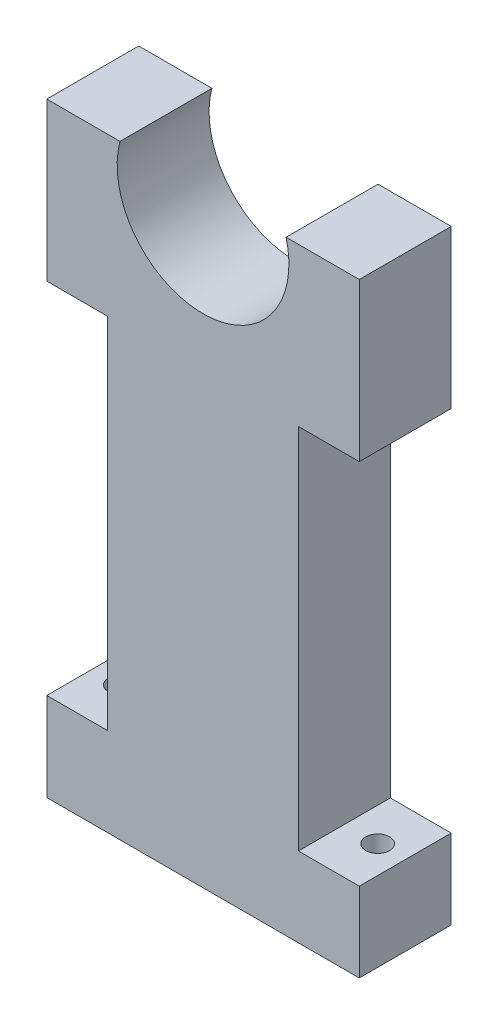
ISO-10303-21;
HEADER;
FILE_DESCRIPTION(('STEP AP214'),'2;1');
FILE_NAME('part.step','',(''),(''),'','','');
FILE_SCHEMA(('AUTOMOTIVE_DESIGN { 1 0 10303 214 1 1 1 1 }'));
ENDSEC;
DATA;
#1=APPLICATION_CONTEXT('core data for automotive mechanical design processes');
#2=APPLICATION_PROTOCOL_DEFINITION('international standard','automotive_design',2000,#1);
#3=PRODUCT_CONTEXT('',#1,'mechanical');
#4=PRODUCT('Part','Part','',(#3));
#5=PRODUCT_RELATED_PRODUCT_CATEGORY('part','',(#4));
#6=PRODUCT_DEFINITION_FORMATION('','',#4);
#7=PRODUCT_DEFINITION_CONTEXT('part definition',#1,'design');
#8=PRODUCT_DEFINITION('design','',#6,#7);
#9=PRODUCT_DEFINITION_SHAPE('','',#8);
#10=(LENGTH_UNIT() NAMED_UNIT(*) SI_UNIT(.MILLI.,.METRE.));
#11=(NAMED_UNIT(*) PLANE_ANGLE_UNIT() SI_UNIT($,.RADIAN.));
#12=(NAMED_UNIT(*) SI_UNIT($,.STERADIAN.) SOLID_ANGLE_UNIT());
#13=UNCERTAINTY_MEASURE_WITH_UNIT(LENGTH_MEASURE(1.E-05),#10,'distance_accuracy_value','');
#14=(GEOMETRIC_REPRESENTATION_CONTEXT(3) GLOBAL_UNCERTAINTY_ASSIGNED_CONTEXT((#13)) GLOBAL_UNIT_ASSIGNED_CONTEXT((#10,
#11,#12)) REPRESENTATION_CONTEXT('',''));
#15=CARTESIAN_POINT('',(0.,0.,0.));
#16=DIRECTION('',(0.,0.,1.));
#17=DIRECTION('',(1.,0.,0.));
#18=AXIS2_PLACEMENT_3D('',#15,#16,#17);
#19=CARTESIAN_POINT('',(0.,12.2171229284665,12.7));
#20=DIRECTION('',(1.,0.,0.));
#21=DIRECTION('',(0.,0.,-1.));
#22=AXIS2_PLACEMENT_3D('',#19,#20,#21);
#23=PLANE('',#22);
#24=DIRECTION('',(0.,-1.,0.));
#25=VECTOR('',#24,1.);
#26=CARTESIAN_POINT('',(0.,12.2171229284665,0.));
#27=LINE('',#26,#25);
#28=CARTESIAN_POINT('',(0.,12.2171229284665,0.));
#29=VERTEX_POINT('',#28);
#30=CARTESIAN_POINT('',(0.,0.,0.));
#31=VERTEX_POINT('',#30);
#32=EDGE_CURVE('E165',#29,#31,#27,.T.);
#33=ORIENTED_EDGE('',*,*,#32,.T.);
#34=DIRECTION('',(0.,0.,-1.));
#35=VECTOR('',#34,1.);
#36=CARTESIAN_POINT('',(0.,0.,12.7));
#37=LINE('',#36,#35);
#38=CARTESIAN_POINT('',(0.,0.,12.7));
#39=VERTEX_POINT('',#38);
#40=EDGE_CURVE('E11',#39,#31,#37,.T.);
#41=ORIENTED_EDGE('',*,*,#40,.F.);
#42=DIRECTION('',(0.,-1.,0.));
#43=VECTOR('',#42,1.);
#44=CARTESIAN_POINT('',(0.,12.2171229284665,12.7));
#45=LINE('',#44,#43);
#46=CARTESIAN_POINT('',(0.,12.2171229284665,12.7));
#47=VERTEX_POINT('',#46);
#48=EDGE_CURVE('E192',#47,#39,#45,.T.);
#49=ORIENTED_EDGE('',*,*,#48,.F.);
#50=DIRECTION('',(0.,0.,-1.));
#51=VECTOR('',#50,1.);
#52=CARTESIAN_POINT('',(0.,12.2171229284665,12.7));
#53=LINE('',#52,#51);
#54=EDGE_CURVE('E161',#47,#29,#53,.T.);
#55=ORIENTED_EDGE('',*,*,#54,.T.);
#56=EDGE_LOOP('',(#33,#41,#49,#55));
#57=FACE_BOUND('',#56,.T.);
#58=ADVANCED_FACE('F33',(#57),#23,.F.);
#59=CARTESIAN_POINT('',(0.,0.,12.7));
#60=DIRECTION('',(0.,1.,0.));
#61=DIRECTION('',(0.,0.,1.));
#62=AXIS2_PLACEMENT_3D('',#59,#60,#61);
#63=PLANE('',#62);
#64=CARTESIAN_POINT('',(39.37,0.,6.35));
#65=DIRECTION('',(0.,-1.,0.));
#66=DIRECTION('',(0.,0.,-1.));
#67=AXIS2_PLACEMENT_3D('',#64,#65,#66);
#68=CIRCLE('',#67,1.651);
#69=CARTESIAN_POINT('',(39.37,0.,4.699));
#70=VERTEX_POINT('',#69);
#71=EDGE_CURVE('E384',#70,#70,#68,.T.);
#72=ORIENTED_EDGE('',*,*,#71,.F.);
#73=EDGE_LOOP('',(#72));
#74=FACE_BOUND('',#73,.T.);
#75=CARTESIAN_POINT('',(3.81,0.,6.35));
#76=DIRECTION('',(0.,-1.,0.));
#77=DIRECTION('',(0.,0.,-1.));
#78=AXIS2_PLACEMENT_3D('',#75,#76,#77);
#79=CIRCLE('',#78,1.651);
#80=CARTESIAN_POINT('',(3.81,0.,4.699));
#81=VERTEX_POINT('',#80);
#82=EDGE_CURVE('E169',#81,#81,#79,.T.);
#83=ORIENTED_EDGE('',*,*,#82,.F.);
#84=EDGE_LOOP('',(#83));
#85=FACE_BOUND('',#84,.T.);
#86=DIRECTION('',(1.,0.,0.));
#87=VECTOR('',#86,1.);
#88=CARTESIAN_POINT('',(0.,0.,0.));
#89=LINE('',#88,#87);
#90=CARTESIAN_POINT('',(43.18,0.,0.));
#91=VERTEX_POINT('',#90);
#92=EDGE_CURVE('E168',#31,#91,#89,.T.);
#93=ORIENTED_EDGE('',*,*,#92,.T.);
#94=DIRECTION('',(0.,0.,-1.));
#95=VECTOR('',#94,1.);
#96=CARTESIAN_POINT('',(43.18,0.,12.7));
#97=LINE('',#96,#95);
#98=CARTESIAN_POINT('',(43.18,0.,12.7));
#99=VERTEX_POINT('',#98);
#100=EDGE_CURVE('E41',#99,#91,#97,.T.);
#101=ORIENTED_EDGE('',*,*,#100,.F.);
#102=DIRECTION('',(1.,0.,0.));
#103=VECTOR('',#102,1.);
#104=CARTESIAN_POINT('',(0.,0.,12.7));
#105=LINE('',#104,#103);
#106=EDGE_CURVE('E110',#39,#99,#105,.T.);
#107=ORIENTED_EDGE('',*,*,#106,.F.);
#108=ORIENTED_EDGE('',*,*,#40,.T.);
#109=EDGE_LOOP('',(#93,#101,#107,#108));
#110=FACE_BOUND('',#109,.T.);
#111=ADVANCED_FACE('F282',(#74,#85,#110),#63,.F.);
#112=CARTESIAN_POINT('',(43.18,0.,12.7));
#113=DIRECTION('',(-1.,0.,0.));
#114=DIRECTION('',(0.,0.,1.));
#115=AXIS2_PLACEMENT_3D('',#112,#113,#114);
#116=PLANE('',#115);
#117=DIRECTION('',(0.,1.,0.));
#118=VECTOR('',#117,1.);
#119=CARTESIAN_POINT('',(43.18,0.,0.));
#120=LINE('',#119,#118);
#121=CARTESIAN_POINT('',(43.18,10.9904486574366,0.));
#122=VERTEX_POINT('',#121);
#123=EDGE_CURVE('E171',#91,#122,#120,.T.);
#124=ORIENTED_EDGE('',*,*,#123,.T.);
#125=DIRECTION('',(0.,0.,-1.));
#126=VECTOR('',#125,1.);
#127=CARTESIAN_POINT('',(43.18,10.9904486574366,12.7));
#128=LINE('',#127,#126);
#129=CARTESIAN_POINT('',(43.18,10.9904486574366,12.7));
#130=VERTEX_POINT('',#129);
#131=EDGE_CURVE('E217',#130,#122,#128,.T.);
#132=ORIENTED_EDGE('',*,*,#131,.F.);
#133=DIRECTION('',(0.,1.,0.));
#134=VECTOR('',#133,1.);
#135=CARTESIAN_POINT('',(43.18,0.,12.7));
#136=LINE('',#135,#134);
#137=EDGE_CURVE('E225',#99,#130,#136,.T.);
#138=ORIENTED_EDGE('',*,*,#137,.F.);
#139=ORIENTED_EDGE('',*,*,#100,.T.);
#140=EDGE_LOOP('',(#124,#132,#138,#139));
#141=FACE_BOUND('',#140,.T.);
#142=ADVANCED_FACE('F223',(#141),#116,.F.);
#143=CARTESIAN_POINT('',(43.18,10.9904486574366,12.7));
#144=DIRECTION('',(0.,-1.,0.));
#145=DIRECTION('',(0.,0.,-1.));
#146=AXIS2_PLACEMENT_3D('',#143,#144,#145);
#147=PLANE('',#146);
#148=CARTESIAN_POINT('',(39.37,10.9904486574366,6.35));
#149=DIRECTION('',(0.,-1.,0.));
#150=DIRECTION('',(0.,0.,-1.));
#151=AXIS2_PLACEMENT_3D('',#148,#149,#150);
#152=CIRCLE('',#151,1.651);
#153=CARTESIAN_POINT('',(39.37,10.9904486574366,4.699));
#154=VERTEX_POINT('',#153);
#155=EDGE_CURVE('E387',#154,#154,#152,.F.);
#156=ORIENTED_EDGE('',*,*,#155,.F.);
#157=EDGE_LOOP('',(#156));
#158=FACE_BOUND('',#157,.T.);
#159=DIRECTION('',(-1.,0.,0.));
#160=VECTOR('',#159,1.);
#161=CARTESIAN_POINT('',(43.18,10.9904486574366,0.));
#162=LINE('',#161,#160);
#163=CARTESIAN_POINT('',(34.7678892102042,10.9904486574366,0.));
#164=VERTEX_POINT('',#163);
#165=EDGE_CURVE('E173',#122,#164,#162,.T.);
#166=ORIENTED_EDGE('',*,*,#165,.T.);
#167=DIRECTION('',(0.,0.,-1.));
#168=VECTOR('',#167,1.);
#169=CARTESIAN_POINT('',(34.7678892102042,10.9904486574366,12.7));
#170=LINE('',#169,#168);
#171=CARTESIAN_POINT('',(34.7678892102042,10.9904486574366,12.7));
#172=VERTEX_POINT('',#171);
#173=EDGE_CURVE('E214',#172,#164,#170,.T.);
#174=ORIENTED_EDGE('',*,*,#173,.F.);
#175=DIRECTION('',(-1.,0.,0.));
#176=VECTOR('',#175,1.);
#177=CARTESIAN_POINT('',(43.18,10.9904486574366,12.7));
#178=LINE('',#177,#176);
#179=EDGE_CURVE('E243',#130,#172,#178,.T.);
#180=ORIENTED_EDGE('',*,*,#179,.F.);
#181=ORIENTED_EDGE('',*,*,#131,.T.);
#182=EDGE_LOOP('',(#166,#174,#180,#181));
#183=FACE_BOUND('',#182,.T.);
#184=ADVANCED_FACE('F234',(#158,#183),#147,.F.);
#185=CARTESIAN_POINT('',(34.7678892102042,10.9904486574366,12.7));
#186=DIRECTION('',(-1.,0.,0.));
#187=DIRECTION('',(0.,0.,1.));
#188=AXIS2_PLACEMENT_3D('',#185,#186,#187);
#189=PLANE('',#188);
#190=DIRECTION('',(0.,1.,0.));
#191=VECTOR('',#190,1.);
#192=CARTESIAN_POINT('',(34.7678892102042,10.9904486574366,0.));
#193=LINE('',#192,#191);
#194=CARTESIAN_POINT('',(34.7678892102042,61.7904486574366,0.));
#195=VERTEX_POINT('',#194);
#196=EDGE_CURVE('E175',#164,#195,#193,.T.);
#197=ORIENTED_EDGE('',*,*,#196,.T.);
#198=DIRECTION('',(0.,0.,-1.));
#199=VECTOR('',#198,1.);
#200=CARTESIAN_POINT('',(34.7678892102042,61.7904486574366,12.7));
#201=LINE('',#200,#199);
#202=CARTESIAN_POINT('',(34.7678892102042,61.7904486574366,12.7));
#203=VERTEX_POINT('',#202);
#204=EDGE_CURVE('E211',#203,#195,#201,.T.);
#205=ORIENTED_EDGE('',*,*,#204,.F.);
#206=DIRECTION('',(0.,1.,0.));
#207=VECTOR('',#206,1.);
#208=CARTESIAN_POINT('',(34.7678892102042,10.9904486574366,12.7));
#209=LINE('',#208,#207);
#210=EDGE_CURVE('E240',#172,#203,#209,.T.);
#211=ORIENTED_EDGE('',*,*,#210,.F.);
#212=ORIENTED_EDGE('',*,*,#173,.T.);
#213=EDGE_LOOP('',(#197,#205,#211,#212));
#214=FACE_BOUND('',#213,.T.);
#215=ADVANCED_FACE('F238',(#214),#189,.F.);
#216=CARTESIAN_POINT('',(34.7678892102042,61.7904486574366,12.7));
#217=DIRECTION('',(0.,1.,0.));
#218=DIRECTION('',(0.,0.,1.));
#219=AXIS2_PLACEMENT_3D('',#216,#217,#218);
#220=PLANE('',#219);
#221=DIRECTION('',(1.,0.,0.));
#222=VECTOR('',#221,1.);
#223=CARTESIAN_POINT('',(34.7678892102042,61.7904486574366,0.));
#224=LINE('',#223,#222);
#225=CARTESIAN_POINT('',(43.18,61.7904486574366,0.));
#226=VERTEX_POINT('',#225);
#227=EDGE_CURVE('E177',#195,#226,#224,.T.);
#228=ORIENTED_EDGE('',*,*,#227,.T.);
#229=DIRECTION('',(0.,0.,-1.));
#230=VECTOR('',#229,1.);
#231=CARTESIAN_POINT('',(43.18,61.7904486574366,12.7));
#232=LINE('',#231,#230);
#233=CARTESIAN_POINT('',(43.18,61.7904486574366,12.7));
#234=VERTEX_POINT('',#233);
#235=EDGE_CURVE('E208',#234,#226,#232,.T.);
#236=ORIENTED_EDGE('',*,*,#235,.F.);
#237=DIRECTION('',(1.,0.,0.));
#238=VECTOR('',#237,1.);
#239=CARTESIAN_POINT('',(34.7678892102042,61.7904486574366,12.7));
#240=LINE('',#239,#238);
#241=EDGE_CURVE('E242',#203,#234,#240,.T.);
#242=ORIENTED_EDGE('',*,*,#241,.F.);
#243=ORIENTED_EDGE('',*,*,#204,.T.);
#244=EDGE_LOOP('',(#228,#236,#242,#243));
#245=FACE_BOUND('',#244,.T.);
#246=ADVANCED_FACE('F299',(#245),#220,.F.);
#247=CARTESIAN_POINT('',(43.18,61.7904486574366,12.7));
#248=DIRECTION('',(-1.,0.,0.));
#249=DIRECTION('',(0.,0.,1.));
#250=AXIS2_PLACEMENT_3D('',#247,#248,#249);
#251=PLANE('',#250);
#252=DIRECTION('',(0.,1.,0.));
#253=VECTOR('',#252,1.);
#254=CARTESIAN_POINT('',(43.18,61.7904486574366,0.));
#255=LINE('',#254,#253);
#256=CARTESIAN_POINT('',(43.18,83.5800703767573,0.));
#257=VERTEX_POINT('',#256);
#258=EDGE_CURVE('E179',#226,#257,#255,.T.);
#259=ORIENTED_EDGE('',*,*,#258,.T.);
#260=DIRECTION('',(0.,0.,-1.));
#261=VECTOR('',#260,1.);
#262=CARTESIAN_POINT('',(43.18,83.5800703767573,12.7));
#263=LINE('',#262,#261);
#264=CARTESIAN_POINT('',(43.18,83.5800703767573,12.7));
#265=VERTEX_POINT('',#264);
#266=EDGE_CURVE('E205',#265,#257,#263,.T.);
#267=ORIENTED_EDGE('',*,*,#266,.F.);
#268=DIRECTION('',(0.,1.,0.));
#269=VECTOR('',#268,1.);
#270=CARTESIAN_POINT('',(43.18,61.7904486574366,12.7));
#271=LINE('',#270,#269);
#272=EDGE_CURVE('E245',#234,#265,#271,.T.);
#273=ORIENTED_EDGE('',*,*,#272,.F.);
#274=ORIENTED_EDGE('',*,*,#235,.T.);
#275=EDGE_LOOP('',(#259,#267,#273,#274));
#276=FACE_BOUND('',#275,.T.);
#277=ADVANCED_FACE('F302',(#276),#251,.F.);
#278=CARTESIAN_POINT('',(43.18,83.5800703767573,12.7));
#279=DIRECTION('',(0.,-1.,0.));
#280=DIRECTION('',(1.,0.,0.));
#281=AXIS2_PLACEMENT_3D('',#278,#279,#280);
#282=PLANE('',#281);
#283=DIRECTION('',(-1.,0.,0.));
#284=VECTOR('',#283,1.);
#285=CARTESIAN_POINT('',(43.18,83.5800703767573,0.));
#286=LINE('',#285,#284);
#287=CARTESIAN_POINT('',(33.0639371353773,83.5800703767573,0.));
#288=VERTEX_POINT('',#287);
#289=EDGE_CURVE('E181',#257,#288,#286,.T.);
#290=ORIENTED_EDGE('',*,*,#289,.T.);
#291=DIRECTION('',(0.,0.,-1.));
#292=VECTOR('',#291,1.);
#293=CARTESIAN_POINT('',(33.0639371353773,83.5800703767573,12.7));
#294=LINE('',#293,#292);
#295=CARTESIAN_POINT('',(33.0639371353773,83.5800703767573,12.7));
#296=VERTEX_POINT('',#295);
#297=EDGE_CURVE('E202',#296,#288,#294,.T.);
#298=ORIENTED_EDGE('',*,*,#297,.F.);
#299=DIRECTION('',(-1.,0.,0.));
#300=VECTOR('',#299,1.);
#301=CARTESIAN_POINT('',(43.18,83.5800703767573,12.7));
#302=LINE('',#301,#300);
#303=EDGE_CURVE('E251',#265,#296,#302,.T.);
#304=ORIENTED_EDGE('',*,*,#303,.F.);
#305=ORIENTED_EDGE('',*,*,#266,.T.);
#306=EDGE_LOOP('',(#290,#298,#304,#305));
#307=FACE_BOUND('',#306,.T.);
#308=ADVANCED_FACE('F306',(#307),#282,.F.);
#309=CARTESIAN_POINT('',(21.59,80.5558438675058,12.7));
#310=DIRECTION('',(0.,0.,-1.));
#311=DIRECTION('',(-1.,0.,0.));
#312=AXIS2_PLACEMENT_3D('',#309,#310,#311);
#313=CYLINDRICAL_SURFACE('',#312,11.8657987243105);
#314=CARTESIAN_POINT('',(21.59,80.5558438675058,0.));
#315=DIRECTION('',(0.,0.,-1.));
#316=DIRECTION('',(1.,0.,0.));
#317=AXIS2_PLACEMENT_3D('',#314,#315,#316);
#318=CIRCLE('',#317,11.8657987243105);
#319=CARTESIAN_POINT('',(10.1160628646227,83.5800703767573,0.));
#320=VERTEX_POINT('',#319);
#321=EDGE_CURVE('E183',#288,#320,#318,.T.);
#322=ORIENTED_EDGE('',*,*,#321,.T.);
#323=DIRECTION('',(0.,0.,-1.));
#324=VECTOR('',#323,1.);
#325=CARTESIAN_POINT('',(10.1160628646227,83.5800703767573,12.7));
#326=LINE('',#325,#324);
#327=CARTESIAN_POINT('',(10.1160628646227,83.5800703767573,12.7));
#328=VERTEX_POINT('',#327);
#329=EDGE_CURVE('E199',#328,#320,#326,.T.);
#330=ORIENTED_EDGE('',*,*,#329,.F.);
#331=CARTESIAN_POINT('',(21.59,80.5558438675058,12.7));
#332=DIRECTION('',(0.,0.,-1.));
#333=DIRECTION('',(1.,0.,0.));
#334=AXIS2_PLACEMENT_3D('',#331,#332,#333);
#335=CIRCLE('',#334,11.8657987243105);
#336=EDGE_CURVE('E253',#296,#328,#335,.T.);
#337=ORIENTED_EDGE('',*,*,#336,.F.);
#338=ORIENTED_EDGE('',*,*,#297,.T.);
#339=EDGE_LOOP('',(#322,#330,#337,#338));
#340=FACE_BOUND('',#339,.T.);
#341=ADVANCED_FACE('F310',(#340),#313,.F.);
#342=CARTESIAN_POINT('',(10.1160628646227,83.5800703767573,12.7));
#343=DIRECTION('',(0.,-1.,0.));
#344=DIRECTION('',(0.,0.,-1.));
#345=AXIS2_PLACEMENT_3D('',#342,#343,#344);
#346=PLANE('',#345);
#347=DIRECTION('',(-1.,0.,0.));
#348=VECTOR('',#347,1.);
#349=CARTESIAN_POINT('',(10.1160628646227,83.5800703767573,0.));
#350=LINE('',#349,#348);
#351=CARTESIAN_POINT('',(0.,83.5800703767573,0.));
#352=VERTEX_POINT('',#351);
#353=EDGE_CURVE('E185',#320,#352,#350,.T.);
#354=ORIENTED_EDGE('',*,*,#353,.T.);
#355=DIRECTION('',(0.,0.,-1.));
#356=VECTOR('',#355,1.);
#357=CARTESIAN_POINT('',(0.,83.5800703767573,12.7));
#358=LINE('',#357,#356);
#359=CARTESIAN_POINT('',(0.,83.5800703767573,12.7));
#360=VERTEX_POINT('',#359);
#361=EDGE_CURVE('E196',#360,#352,#358,.T.);
#362=ORIENTED_EDGE('',*,*,#361,.F.);
#363=DIRECTION('',(-1.,0.,0.));
#364=VECTOR('',#363,1.);
#365=CARTESIAN_POINT('',(10.1160628646227,83.5800703767573,12.7));
#366=LINE('',#365,#364);
#367=EDGE_CURVE('E255',#328,#360,#366,.T.);
#368=ORIENTED_EDGE('',*,*,#367,.F.);
#369=ORIENTED_EDGE('',*,*,#329,.T.);
#370=EDGE_LOOP('',(#354,#362,#368,#369));
#371=FACE_BOUND('',#370,.T.);
#372=ADVANCED_FACE('F261',(#371),#346,.F.);
#373=CARTESIAN_POINT('',(0.,83.5800703767573,12.7));
#374=DIRECTION('',(1.,0.,0.));
#375=DIRECTION('',(0.,1.,0.));
#376=AXIS2_PLACEMENT_3D('',#373,#374,#375);
#377=PLANE('',#376);
#378=DIRECTION('',(0.,-1.,0.));
#379=VECTOR('',#378,1.);
#380=CARTESIAN_POINT('',(0.,83.5800703767573,0.));
#381=LINE('',#380,#379);
#382=CARTESIAN_POINT('',(0.,61.7904486574366,0.));
#383=VERTEX_POINT('',#382);
#384=EDGE_CURVE('E187',#352,#383,#381,.T.);
#385=ORIENTED_EDGE('',*,*,#384,.T.);
#386=DIRECTION('',(0.,0.,-1.));
#387=VECTOR('',#386,1.);
#388=CARTESIAN_POINT('',(0.,61.7904486574366,12.7));
#389=LINE('',#388,#387);
#390=CARTESIAN_POINT('',(0.,61.7904486574366,12.7));
#391=VERTEX_POINT('',#390);
#392=EDGE_CURVE('E156',#391,#383,#389,.T.);
#393=ORIENTED_EDGE('',*,*,#392,.F.);
#394=DIRECTION('',(0.,-1.,0.));
#395=VECTOR('',#394,1.);
#396=CARTESIAN_POINT('',(0.,83.5800703767573,12.7));
#397=LINE('',#396,#395);
#398=EDGE_CURVE('E147',#360,#391,#397,.T.);
#399=ORIENTED_EDGE('',*,*,#398,.F.);
#400=ORIENTED_EDGE('',*,*,#361,.T.);
#401=EDGE_LOOP('',(#385,#393,#399,#400));
#402=FACE_BOUND('',#401,.T.);
#403=ADVANCED_FACE('F265',(#402),#377,.F.);
#404=CARTESIAN_POINT('',(0.,61.7904486574366,12.7));
#405=DIRECTION('',(0.,1.,0.));
#406=DIRECTION('',(0.,0.,1.));
#407=AXIS2_PLACEMENT_3D('',#404,#405,#406);
#408=PLANE('',#407);
#409=DIRECTION('',(1.,0.,0.));
#410=VECTOR('',#409,1.);
#411=CARTESIAN_POINT('',(0.,61.7904486574366,0.));
#412=LINE('',#411,#410);
#413=CARTESIAN_POINT('',(8.41211078979583,61.7904486574366,0.));
#414=VERTEX_POINT('',#413);
#415=EDGE_CURVE('E155',#383,#414,#412,.T.);
#416=ORIENTED_EDGE('',*,*,#415,.T.);
#417=DIRECTION('',(0.,0.,-1.));
#418=VECTOR('',#417,1.);
#419=CARTESIAN_POINT('',(8.41211078979583,61.7904486574366,12.7));
#420=LINE('',#419,#418);
#421=CARTESIAN_POINT('',(8.41211078979583,61.7904486574366,12.7));
#422=VERTEX_POINT('',#421);
#423=EDGE_CURVE('E152',#422,#414,#420,.T.);
#424=ORIENTED_EDGE('',*,*,#423,.F.);
#425=DIRECTION('',(1.,0.,0.));
#426=VECTOR('',#425,1.);
#427=CARTESIAN_POINT('',(0.,61.7904486574366,12.7));
#428=LINE('',#427,#426);
#429=EDGE_CURVE('E141',#391,#422,#428,.T.);
#430=ORIENTED_EDGE('',*,*,#429,.F.);
#431=ORIENTED_EDGE('',*,*,#392,.T.);
#432=EDGE_LOOP('',(#416,#424,#430,#431));
#433=FACE_BOUND('',#432,.T.);
#434=ADVANCED_FACE('F153',(#433),#408,.F.);
#435=CARTESIAN_POINT('',(8.41211078979583,61.7904486574366,12.7));
#436=DIRECTION('',(1.,0.,0.));
#437=DIRECTION('',(0.,0.,-1.));
#438=AXIS2_PLACEMENT_3D('',#435,#436,#437);
#439=PLANE('',#438);
#440=DIRECTION('',(0.,-1.,0.));
#441=VECTOR('',#440,1.);
#442=CARTESIAN_POINT('',(8.41211078979583,61.7904486574366,0.));
#443=LINE('',#442,#441);
#444=CARTESIAN_POINT('',(8.41211078979583,12.2171229284665,0.));
#445=VERTEX_POINT('',#444);
#446=EDGE_CURVE('E96',#414,#445,#443,.T.);
#447=ORIENTED_EDGE('',*,*,#446,.T.);
#448=DIRECTION('',(0.,0.,-1.));
#449=VECTOR('',#448,1.);
#450=CARTESIAN_POINT('',(8.41211078979583,12.2171229284665,12.7));
#451=LINE('',#450,#449);
#452=CARTESIAN_POINT('',(8.41211078979583,12.2171229284665,12.7));
#453=VERTEX_POINT('',#452);
#454=EDGE_CURVE('E157',#453,#445,#451,.T.);
#455=ORIENTED_EDGE('',*,*,#454,.F.);
#456=DIRECTION('',(0.,-1.,0.));
#457=VECTOR('',#456,1.);
#458=CARTESIAN_POINT('',(8.41211078979583,61.7904486574366,12.7));
#459=LINE('',#458,#457);
#460=EDGE_CURVE('E145',#422,#453,#459,.T.);
#461=ORIENTED_EDGE('',*,*,#460,.F.);
#462=ORIENTED_EDGE('',*,*,#423,.T.);
#463=EDGE_LOOP('',(#447,#455,#461,#462));
#464=FACE_BOUND('',#463,.T.);
#465=ADVANCED_FACE('F159',(#464),#439,.F.);
#466=CARTESIAN_POINT('',(8.41211078979583,12.2171229284665,12.7));
#467=DIRECTION('',(0.,-1.,0.));
#468=DIRECTION('',(0.,0.,-1.));
#469=AXIS2_PLACEMENT_3D('',#466,#467,#468);
#470=PLANE('',#469);
#471=CARTESIAN_POINT('',(3.81,12.2171229284665,6.35));
#472=DIRECTION('',(0.,-1.,0.));
#473=DIRECTION('',(0.,0.,-1.));
#474=AXIS2_PLACEMENT_3D('',#471,#472,#473);
#475=CIRCLE('',#474,1.651);
#476=CARTESIAN_POINT('',(3.81,12.2171229284665,4.699));
#477=VERTEX_POINT('',#476);
#478=EDGE_CURVE('E388',#477,#477,#475,.F.);
#479=ORIENTED_EDGE('',*,*,#478,.F.);
#480=EDGE_LOOP('',(#479));
#481=FACE_BOUND('',#480,.T.);
#482=DIRECTION('',(-1.,0.,0.));
#483=VECTOR('',#482,1.);
#484=CARTESIAN_POINT('',(8.41211078979583,12.2171229284665,0.));
#485=LINE('',#484,#483);
#486=EDGE_CURVE('E102',#445,#29,#485,.T.);
#487=ORIENTED_EDGE('',*,*,#486,.T.);
#488=ORIENTED_EDGE('',*,*,#54,.F.);
#489=DIRECTION('',(-1.,0.,0.));
#490=VECTOR('',#489,1.);
#491=CARTESIAN_POINT('',(8.41211078979583,12.2171229284665,12.7));
#492=LINE('',#491,#490);
#493=EDGE_CURVE('E49',#453,#47,#492,.T.);
#494=ORIENTED_EDGE('',*,*,#493,.F.);
#495=ORIENTED_EDGE('',*,*,#454,.T.);
#496=EDGE_LOOP('',(#487,#488,#494,#495));
#497=FACE_BOUND('',#496,.T.);
#498=ADVANCED_FACE('F269',(#481,#497),#470,.F.);
#499=CARTESIAN_POINT('',(21.59,80.5558438675058,12.7));
#500=DIRECTION('',(0.,0.,1.));
#501=DIRECTION('',(1.,0.,0.));
#502=AXIS2_PLACEMENT_3D('',#499,#500,#501);
#503=PLANE('',#502);
#504=ORIENTED_EDGE('',*,*,#48,.T.);
#505=ORIENTED_EDGE('',*,*,#106,.T.);
#506=ORIENTED_EDGE('',*,*,#137,.T.);
#507=ORIENTED_EDGE('',*,*,#179,.T.);
#508=ORIENTED_EDGE('',*,*,#210,.T.);
#509=ORIENTED_EDGE('',*,*,#241,.T.);
#510=ORIENTED_EDGE('',*,*,#272,.T.);
#511=ORIENTED_EDGE('',*,*,#303,.T.);
#512=ORIENTED_EDGE('',*,*,#336,.T.);
#513=ORIENTED_EDGE('',*,*,#367,.T.);
#514=ORIENTED_EDGE('',*,*,#398,.T.);
#515=ORIENTED_EDGE('',*,*,#429,.T.);
#516=ORIENTED_EDGE('',*,*,#460,.T.);
#517=ORIENTED_EDGE('',*,*,#493,.T.);
#518=EDGE_LOOP('',(#504,#505,#506,#507,#508,#509,#510,#511,#512,#513,#514,#515,#516,#517));
#519=FACE_BOUND('',#518,.T.);
#520=ADVANCED_FACE('F143',(#519),#503,.T.);
#521=CARTESIAN_POINT('',(21.59,80.5558438675058,0.));
#522=DIRECTION('',(0.,0.,1.));
#523=DIRECTION('',(1.,0.,0.));
#524=AXIS2_PLACEMENT_3D('',#521,#522,#523);
#525=PLANE('',#524);
#526=ORIENTED_EDGE('',*,*,#32,.F.);
#527=ORIENTED_EDGE('',*,*,#486,.F.);
#528=ORIENTED_EDGE('',*,*,#446,.F.);
#529=ORIENTED_EDGE('',*,*,#415,.F.);
#530=ORIENTED_EDGE('',*,*,#384,.F.);
#531=ORIENTED_EDGE('',*,*,#353,.F.);
#532=ORIENTED_EDGE('',*,*,#321,.F.);
#533=ORIENTED_EDGE('',*,*,#289,.F.);
#534=ORIENTED_EDGE('',*,*,#258,.F.);
#535=ORIENTED_EDGE('',*,*,#227,.F.);
#536=ORIENTED_EDGE('',*,*,#196,.F.);
#537=ORIENTED_EDGE('',*,*,#165,.F.);
#538=ORIENTED_EDGE('',*,*,#123,.F.);
#539=ORIENTED_EDGE('',*,*,#92,.F.);
#540=EDGE_LOOP('',(#526,#527,#528,#529,#530,#531,#532,#533,#534,#535,#536,#537,#538,#539));
#541=FACE_BOUND('',#540,.T.);
#542=ADVANCED_FACE('F229',(#541),#525,.F.);
#543=CARTESIAN_POINT('',(3.81,83.5810703767573,6.35));
#544=DIRECTION('',(0.,-1.,0.));
#545=DIRECTION('',(0.,0.,-1.));
#546=AXIS2_PLACEMENT_3D('',#543,#544,#545);
#547=CYLINDRICAL_SURFACE('',#546,1.651);
#548=ORIENTED_EDGE('',*,*,#82,.T.);
#549=EDGE_LOOP('',(#548));
#550=FACE_BOUND('',#549,.T.);
#551=ORIENTED_EDGE('',*,*,#478,.T.);
#552=EDGE_LOOP('',(#551));
#553=FACE_BOUND('',#552,.T.);
#554=ADVANCED_FACE('F343',(#550,#553),#547,.F.);
#555=CARTESIAN_POINT('',(39.37,83.5810703767573,6.35));
#556=DIRECTION('',(0.,-1.,0.));
#557=DIRECTION('',(0.,0.,-1.));
#558=AXIS2_PLACEMENT_3D('',#555,#556,#557);
#559=CYLINDRICAL_SURFACE('',#558,1.651);
#560=ORIENTED_EDGE('',*,*,#71,.T.);
#561=EDGE_LOOP('',(#560));
#562=FACE_BOUND('',#561,.T.);
#563=ORIENTED_EDGE('',*,*,#155,.T.);
#564=EDGE_LOOP('',(#563));
#565=FACE_BOUND('',#564,.T.);
#566=ADVANCED_FACE('F368',(#562,#565),#559,.F.);
#567=CLOSED_SHELL('',(#58,#111,#142,#184,#215,#246,#277,#308,#341,#372,#403,#434,#465,#498,#520,
#542,#554,#566));
#568=MANIFOLD_SOLID_BREP('B2',#567);
#569=ADVANCED_BREP_SHAPE_REPRESENTATION('',(#18,#568),#14);
#570=SHAPE_DEFINITION_REPRESENTATION(#9,#569);
ENDSEC;
END-ISO-10303-21;
